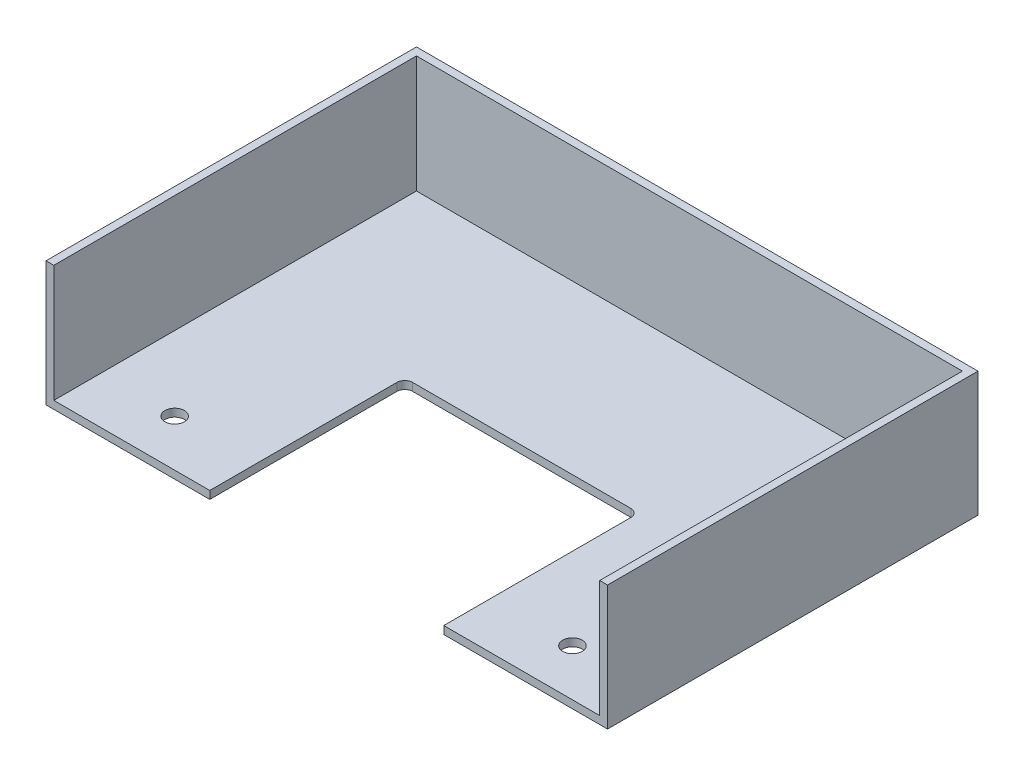
ISO-10303-21;
HEADER;
FILE_DESCRIPTION(('STEP AP214'),'2;1');
FILE_NAME('part.step','',(''),(''),'','','');
FILE_SCHEMA(('AUTOMOTIVE_DESIGN { 1 0 10303 214 1 1 1 1 }'));
ENDSEC;
DATA;
#1=APPLICATION_CONTEXT('core data for automotive mechanical design processes');
#2=APPLICATION_PROTOCOL_DEFINITION('international standard','automotive_design',2000,#1);
#3=PRODUCT_CONTEXT('',#1,'mechanical');
#4=PRODUCT('Part','Part','',(#3));
#5=PRODUCT_RELATED_PRODUCT_CATEGORY('part','',(#4));
#6=PRODUCT_DEFINITION_FORMATION('','',#4);
#7=PRODUCT_DEFINITION_CONTEXT('part definition',#1,'design');
#8=PRODUCT_DEFINITION('design','',#6,#7);
#9=PRODUCT_DEFINITION_SHAPE('','',#8);
#10=(LENGTH_UNIT() NAMED_UNIT(*) SI_UNIT(.MILLI.,.METRE.));
#11=(NAMED_UNIT(*) PLANE_ANGLE_UNIT() SI_UNIT($,.RADIAN.));
#12=(NAMED_UNIT(*) SI_UNIT($,.STERADIAN.) SOLID_ANGLE_UNIT());
#13=UNCERTAINTY_MEASURE_WITH_UNIT(LENGTH_MEASURE(1.E-05),#10,'distance_accuracy_value','');
#14=(GEOMETRIC_REPRESENTATION_CONTEXT(3) GLOBAL_UNCERTAINTY_ASSIGNED_CONTEXT((#13)) GLOBAL_UNIT_ASSIGNED_CONTEXT((#10,
#11,#12)) REPRESENTATION_CONTEXT('',''));
#15=CARTESIAN_POINT('',(0.,0.,0.));
#16=DIRECTION('',(0.,0.,1.));
#17=DIRECTION('',(1.,0.,0.));
#18=AXIS2_PLACEMENT_3D('',#15,#16,#17);
#19=CARTESIAN_POINT('',(0.,0.,0.));
#20=DIRECTION('',(0.,-1.,0.));
#21=DIRECTION('',(0.,0.,-1.));
#22=AXIS2_PLACEMENT_3D('',#19,#20,#21);
#23=PLANE('',#22);
#24=DIRECTION('',(0.,0.,1.));
#25=VECTOR('',#24,1.);
#26=CARTESIAN_POINT('',(30.,0.,-0.5));
#27=LINE('',#26,#25);
#28=CARTESIAN_POINT('',(30.,0.,-0.5));
#29=VERTEX_POINT('',#28);
#30=CARTESIAN_POINT('',(30.,0.,47.5));
#31=VERTEX_POINT('',#30);
#32=EDGE_CURVE('E140',#29,#31,#27,.T.);
#33=ORIENTED_EDGE('',*,*,#32,.F.);
#34=CARTESIAN_POINT('',(28.,0.,-0.5));
#35=DIRECTION('',(0.,-1.,0.));
#36=DIRECTION('',(0.,0.,-1.));
#37=AXIS2_PLACEMENT_3D('',#34,#35,#36);
#38=CIRCLE('',#37,2.);
#39=CARTESIAN_POINT('',(28.,0.,-2.5));
#40=VERTEX_POINT('',#39);
#41=EDGE_CURVE('E162',#40,#29,#38,.T.);
#42=ORIENTED_EDGE('',*,*,#41,.F.);
#43=DIRECTION('',(1.,0.,0.));
#44=VECTOR('',#43,1.);
#45=CARTESIAN_POINT('',(-28.,0.,-2.5));
#46=LINE('',#45,#44);
#47=CARTESIAN_POINT('',(-28.,0.,-2.5));
#48=VERTEX_POINT('',#47);
#49=EDGE_CURVE('E206',#48,#40,#46,.T.);
#50=ORIENTED_EDGE('',*,*,#49,.F.);
#51=CARTESIAN_POINT('',(-28.,0.,-0.5));
#52=DIRECTION('',(0.,-1.,0.));
#53=DIRECTION('',(0.,0.,-1.));
#54=AXIS2_PLACEMENT_3D('',#51,#52,#53);
#55=CIRCLE('',#54,2.);
#56=CARTESIAN_POINT('',(-30.,0.,-0.5));
#57=VERTEX_POINT('',#56);
#58=EDGE_CURVE('E217',#57,#48,#55,.T.);
#59=ORIENTED_EDGE('',*,*,#58,.F.);
#60=DIRECTION('',(0.,0.,-1.));
#61=VECTOR('',#60,1.);
#62=CARTESIAN_POINT('',(-30.,0.,47.5));
#63=LINE('',#62,#61);
#64=CARTESIAN_POINT('',(-30.,0.,47.5));
#65=VERTEX_POINT('',#64);
#66=EDGE_CURVE('E151',#65,#57,#63,.T.);
#67=ORIENTED_EDGE('',*,*,#66,.F.);
#68=DIRECTION('',(-1.,0.,0.));
#69=VECTOR('',#68,1.);
#70=CARTESIAN_POINT('',(72.,0.,47.5));
#71=LINE('',#70,#69);
#72=CARTESIAN_POINT('',(-72.,0.,47.5));
#73=VERTEX_POINT('',#72);
#74=EDGE_CURVE('E169',#65,#73,#71,.T.);
#75=ORIENTED_EDGE('',*,*,#74,.T.);
#76=DIRECTION('',(0.,0.,-1.));
#77=VECTOR('',#76,1.);
#78=CARTESIAN_POINT('',(-72.,0.,47.5));
#79=LINE('',#78,#77);
#80=CARTESIAN_POINT('',(-72.,0.,-47.5));
#81=VERTEX_POINT('',#80);
#82=EDGE_CURVE('E168',#73,#81,#79,.T.);
#83=ORIENTED_EDGE('',*,*,#82,.T.);
#84=DIRECTION('',(1.,0.,0.));
#85=VECTOR('',#84,1.);
#86=CARTESIAN_POINT('',(-72.,0.,-47.5));
#87=LINE('',#86,#85);
#88=CARTESIAN_POINT('',(72.,0.,-47.5));
#89=VERTEX_POINT('',#88);
#90=EDGE_CURVE('E172',#81,#89,#87,.T.);
#91=ORIENTED_EDGE('',*,*,#90,.T.);
#92=DIRECTION('',(0.,0.,1.));
#93=VECTOR('',#92,1.);
#94=CARTESIAN_POINT('',(72.,0.,-47.5));
#95=LINE('',#94,#93);
#96=CARTESIAN_POINT('',(72.,0.,47.5));
#97=VERTEX_POINT('',#96);
#98=EDGE_CURVE('E167',#89,#97,#95,.T.);
#99=ORIENTED_EDGE('',*,*,#98,.T.);
#100=EDGE_CURVE('E158',#97,#31,#71,.T.);
#101=ORIENTED_EDGE('',*,*,#100,.T.);
#102=EDGE_LOOP('',(#33,#42,#50,#59,#67,#75,#83,#91,#99,#101));
#103=FACE_BOUND('',#102,.T.);
#104=CARTESIAN_POINT('',(-51.,0.,35.5));
#105=DIRECTION('',(0.,1.,0.));
#106=DIRECTION('',(0.,0.,1.));
#107=AXIS2_PLACEMENT_3D('',#104,#105,#106);
#108=CIRCLE('',#107,2.49999999999999);
#109=CARTESIAN_POINT('',(-51.,0.,38.));
#110=VERTEX_POINT('',#109);
#111=EDGE_CURVE('E152',#110,#110,#108,.T.);
#112=ORIENTED_EDGE('',*,*,#111,.T.);
#113=EDGE_LOOP('',(#112));
#114=FACE_BOUND('',#113,.T.);
#115=CARTESIAN_POINT('',(51.,0.,35.5));
#116=DIRECTION('',(0.,1.,0.));
#117=DIRECTION('',(0.,0.,1.));
#118=AXIS2_PLACEMENT_3D('',#115,#116,#117);
#119=CIRCLE('',#118,2.49999999999999);
#120=CARTESIAN_POINT('',(51.,0.,38.));
#121=VERTEX_POINT('',#120);
#122=EDGE_CURVE('E341',#121,#121,#119,.T.);
#123=ORIENTED_EDGE('',*,*,#122,.T.);
#124=EDGE_LOOP('',(#123));
#125=FACE_BOUND('',#124,.T.);
#126=ADVANCED_FACE('F39',(#103,#114,#125),#23,.T.);
#127=CARTESIAN_POINT('',(72.,32.,47.5));
#128=DIRECTION('',(0.,0.,1.));
#129=DIRECTION('',(1.,0.,0.));
#130=AXIS2_PLACEMENT_3D('',#127,#128,#129);
#131=PLANE('',#130);
#132=DIRECTION('',(0.,-1.,0.));
#133=VECTOR('',#132,1.);
#134=CARTESIAN_POINT('',(30.,32.,47.5));
#135=LINE('',#134,#133);
#136=CARTESIAN_POINT('',(30.,1.99999999999999,47.5));
#137=VERTEX_POINT('',#136);
#138=EDGE_CURVE('E143',#137,#31,#135,.T.);
#139=ORIENTED_EDGE('',*,*,#138,.T.);
#140=ORIENTED_EDGE('',*,*,#100,.F.);
#141=DIRECTION('',(0.,-1.,0.));
#142=VECTOR('',#141,1.);
#143=CARTESIAN_POINT('',(72.,32.,47.5));
#144=LINE('',#143,#142);
#145=CARTESIAN_POINT('',(72.,32.,47.5));
#146=VERTEX_POINT('',#145);
#147=EDGE_CURVE('E187',#146,#97,#144,.T.);
#148=ORIENTED_EDGE('',*,*,#147,.F.);
#149=DIRECTION('',(-1.,0.,0.));
#150=VECTOR('',#149,1.);
#151=CARTESIAN_POINT('',(72.,32.,47.5));
#152=LINE('',#151,#150);
#153=CARTESIAN_POINT('',(70.,32.,47.5));
#154=VERTEX_POINT('',#153);
#155=EDGE_CURVE('E252',#146,#154,#152,.T.);
#156=ORIENTED_EDGE('',*,*,#155,.T.);
#157=DIRECTION('',(0.,1.,0.));
#158=VECTOR('',#157,1.);
#159=CARTESIAN_POINT('',(70.,1.99999999999999,47.5));
#160=LINE('',#159,#158);
#161=CARTESIAN_POINT('',(70.,1.99999999999999,47.5));
#162=VERTEX_POINT('',#161);
#163=EDGE_CURVE('E62',#162,#154,#160,.T.);
#164=ORIENTED_EDGE('',*,*,#163,.F.);
#165=DIRECTION('',(1.,0.,0.));
#166=VECTOR('',#165,1.);
#167=CARTESIAN_POINT('',(-70.,1.99999999999999,47.5));
#168=LINE('',#167,#166);
#169=EDGE_CURVE('E160',#137,#162,#168,.T.);
#170=ORIENTED_EDGE('',*,*,#169,.F.);
#171=EDGE_LOOP('',(#139,#140,#148,#156,#164,#170));
#172=FACE_BOUND('',#171,.T.);
#173=ADVANCED_FACE('F157',(#172),#131,.T.);
#174=CARTESIAN_POINT('',(72.,32.,-47.5));
#175=DIRECTION('',(1.,0.,0.));
#176=DIRECTION('',(0.,0.,-1.));
#177=AXIS2_PLACEMENT_3D('',#174,#175,#176);
#178=PLANE('',#177);
#179=ORIENTED_EDGE('',*,*,#98,.F.);
#180=DIRECTION('',(0.,-1.,0.));
#181=VECTOR('',#180,1.);
#182=CARTESIAN_POINT('',(72.,32.,-47.5));
#183=LINE('',#182,#181);
#184=CARTESIAN_POINT('',(72.,32.,-47.5));
#185=VERTEX_POINT('',#184);
#186=EDGE_CURVE('E179',#185,#89,#183,.T.);
#187=ORIENTED_EDGE('',*,*,#186,.F.);
#188=DIRECTION('',(0.,0.,1.));
#189=VECTOR('',#188,1.);
#190=CARTESIAN_POINT('',(72.,32.,-47.5));
#191=LINE('',#190,#189);
#192=EDGE_CURVE('E178',#185,#146,#191,.T.);
#193=ORIENTED_EDGE('',*,*,#192,.T.);
#194=ORIENTED_EDGE('',*,*,#147,.T.);
#195=EDGE_LOOP('',(#179,#187,#193,#194));
#196=FACE_BOUND('',#195,.T.);
#197=ADVANCED_FACE('F41',(#196),#178,.T.);
#198=CARTESIAN_POINT('',(-72.,32.,-47.5));
#199=DIRECTION('',(0.,0.,-1.));
#200=DIRECTION('',(-1.,0.,0.));
#201=AXIS2_PLACEMENT_3D('',#198,#199,#200);
#202=PLANE('',#201);
#203=ORIENTED_EDGE('',*,*,#90,.F.);
#204=DIRECTION('',(0.,-1.,0.));
#205=VECTOR('',#204,1.);
#206=CARTESIAN_POINT('',(-72.,32.,-47.5));
#207=LINE('',#206,#205);
#208=CARTESIAN_POINT('',(-72.,32.,-47.5));
#209=VERTEX_POINT('',#208);
#210=EDGE_CURVE('E182',#209,#81,#207,.T.);
#211=ORIENTED_EDGE('',*,*,#210,.F.);
#212=DIRECTION('',(1.,0.,0.));
#213=VECTOR('',#212,1.);
#214=CARTESIAN_POINT('',(-72.,32.,-47.5));
#215=LINE('',#214,#213);
#216=EDGE_CURVE('E189',#209,#185,#215,.T.);
#217=ORIENTED_EDGE('',*,*,#216,.T.);
#218=ORIENTED_EDGE('',*,*,#186,.T.);
#219=EDGE_LOOP('',(#203,#211,#217,#218));
#220=FACE_BOUND('',#219,.T.);
#221=ADVANCED_FACE('F261',(#220),#202,.T.);
#222=CARTESIAN_POINT('',(-72.,32.,47.5));
#223=DIRECTION('',(-1.,0.,0.));
#224=DIRECTION('',(0.,0.,1.));
#225=AXIS2_PLACEMENT_3D('',#222,#223,#224);
#226=PLANE('',#225);
#227=ORIENTED_EDGE('',*,*,#82,.F.);
#228=DIRECTION('',(0.,-1.,0.));
#229=VECTOR('',#228,1.);
#230=CARTESIAN_POINT('',(-72.,32.,47.5));
#231=LINE('',#230,#229);
#232=CARTESIAN_POINT('',(-72.,32.,47.5));
#233=VERTEX_POINT('',#232);
#234=EDGE_CURVE('E184',#233,#73,#231,.T.);
#235=ORIENTED_EDGE('',*,*,#234,.F.);
#236=DIRECTION('',(0.,0.,-1.));
#237=VECTOR('',#236,1.);
#238=CARTESIAN_POINT('',(-72.,32.,47.5));
#239=LINE('',#238,#237);
#240=EDGE_CURVE('E255',#233,#209,#239,.T.);
#241=ORIENTED_EDGE('',*,*,#240,.T.);
#242=ORIENTED_EDGE('',*,*,#210,.T.);
#243=EDGE_LOOP('',(#227,#235,#241,#242));
#244=FACE_BOUND('',#243,.T.);
#245=ADVANCED_FACE('F274',(#244),#226,.T.);
#246=DIRECTION('',(0.,-1.,0.));
#247=VECTOR('',#246,1.);
#248=CARTESIAN_POINT('',(-30.,32.,47.5));
#249=LINE('',#248,#247);
#250=CARTESIAN_POINT('',(-30.,1.99999999999999,47.5));
#251=VERTEX_POINT('',#250);
#252=EDGE_CURVE('E161',#251,#65,#249,.T.);
#253=ORIENTED_EDGE('',*,*,#252,.F.);
#254=CARTESIAN_POINT('',(-70.,1.99999999999999,47.5));
#255=VERTEX_POINT('',#254);
#256=EDGE_CURVE('E223',#255,#251,#168,.T.);
#257=ORIENTED_EDGE('',*,*,#256,.F.);
#258=DIRECTION('',(0.,1.,0.));
#259=VECTOR('',#258,1.);
#260=CARTESIAN_POINT('',(-70.,1.99999999999999,47.5));
#261=LINE('',#260,#259);
#262=CARTESIAN_POINT('',(-70.,32.,47.5));
#263=VERTEX_POINT('',#262);
#264=EDGE_CURVE('E241',#255,#263,#261,.T.);
#265=ORIENTED_EDGE('',*,*,#264,.T.);
#266=EDGE_CURVE('E251',#263,#233,#152,.T.);
#267=ORIENTED_EDGE('',*,*,#266,.T.);
#268=ORIENTED_EDGE('',*,*,#234,.T.);
#269=ORIENTED_EDGE('',*,*,#74,.F.);
#270=EDGE_LOOP('',(#253,#257,#265,#267,#268,#269));
#271=FACE_BOUND('',#270,.T.);
#272=ADVANCED_FACE('F277',(#271),#131,.T.);
#273=CARTESIAN_POINT('',(0.,32.,0.));
#274=DIRECTION('',(0.,-1.,0.));
#275=DIRECTION('',(0.,0.,-1.));
#276=AXIS2_PLACEMENT_3D('',#273,#274,#275);
#277=PLANE('',#276);
#278=ORIENTED_EDGE('',*,*,#266,.F.);
#279=DIRECTION('',(0.,0.,1.));
#280=VECTOR('',#279,1.);
#281=CARTESIAN_POINT('',(-70.,32.,-45.5));
#282=LINE('',#281,#280);
#283=CARTESIAN_POINT('',(-70.,32.,-45.5));
#284=VERTEX_POINT('',#283);
#285=EDGE_CURVE('E239',#284,#263,#282,.T.);
#286=ORIENTED_EDGE('',*,*,#285,.F.);
#287=DIRECTION('',(-1.,0.,0.));
#288=VECTOR('',#287,1.);
#289=CARTESIAN_POINT('',(70.,32.,-45.5));
#290=LINE('',#289,#288);
#291=CARTESIAN_POINT('',(70.,32.,-45.5));
#292=VERTEX_POINT('',#291);
#293=EDGE_CURVE('E236',#292,#284,#290,.T.);
#294=ORIENTED_EDGE('',*,*,#293,.F.);
#295=DIRECTION('',(0.,0.,-1.));
#296=VECTOR('',#295,1.);
#297=CARTESIAN_POINT('',(70.,32.,47.5));
#298=LINE('',#297,#296);
#299=EDGE_CURVE('E234',#154,#292,#298,.T.);
#300=ORIENTED_EDGE('',*,*,#299,.F.);
#301=ORIENTED_EDGE('',*,*,#155,.F.);
#302=ORIENTED_EDGE('',*,*,#192,.F.);
#303=ORIENTED_EDGE('',*,*,#216,.F.);
#304=ORIENTED_EDGE('',*,*,#240,.F.);
#305=EDGE_LOOP('',(#278,#286,#294,#300,#301,#302,#303,#304));
#306=FACE_BOUND('',#305,.T.);
#307=ADVANCED_FACE('F266',(#306),#277,.F.);
#308=CARTESIAN_POINT('',(-70.,1.99999999999999,-45.5));
#309=DIRECTION('',(-1.,0.,0.));
#310=DIRECTION('',(0.,0.,1.));
#311=AXIS2_PLACEMENT_3D('',#308,#309,#310);
#312=PLANE('',#311);
#313=ORIENTED_EDGE('',*,*,#285,.T.);
#314=ORIENTED_EDGE('',*,*,#264,.F.);
#315=DIRECTION('',(0.,0.,1.));
#316=VECTOR('',#315,1.);
#317=CARTESIAN_POINT('',(-70.,1.99999999999999,-45.5));
#318=LINE('',#317,#316);
#319=CARTESIAN_POINT('',(-70.,1.99999999999999,-45.5));
#320=VERTEX_POINT('',#319);
#321=EDGE_CURVE('E231',#320,#255,#318,.T.);
#322=ORIENTED_EDGE('',*,*,#321,.F.);
#323=DIRECTION('',(0.,1.,0.));
#324=VECTOR('',#323,1.);
#325=CARTESIAN_POINT('',(-70.,1.99999999999999,-45.5));
#326=LINE('',#325,#324);
#327=EDGE_CURVE('E244',#320,#284,#326,.T.);
#328=ORIENTED_EDGE('',*,*,#327,.T.);
#329=EDGE_LOOP('',(#313,#314,#322,#328));
#330=FACE_BOUND('',#329,.T.);
#331=ADVANCED_FACE('F282',(#330),#312,.F.);
#332=CARTESIAN_POINT('',(70.,1.99999999999999,-45.5));
#333=DIRECTION('',(0.,0.,-1.));
#334=DIRECTION('',(-1.,0.,0.));
#335=AXIS2_PLACEMENT_3D('',#332,#333,#334);
#336=PLANE('',#335);
#337=ORIENTED_EDGE('',*,*,#293,.T.);
#338=ORIENTED_EDGE('',*,*,#327,.F.);
#339=DIRECTION('',(-1.,0.,0.));
#340=VECTOR('',#339,1.);
#341=CARTESIAN_POINT('',(70.,1.99999999999999,-45.5));
#342=LINE('',#341,#340);
#343=CARTESIAN_POINT('',(70.,1.99999999999999,-45.5));
#344=VERTEX_POINT('',#343);
#345=EDGE_CURVE('E228',#344,#320,#342,.T.);
#346=ORIENTED_EDGE('',*,*,#345,.F.);
#347=DIRECTION('',(0.,1.,0.));
#348=VECTOR('',#347,1.);
#349=CARTESIAN_POINT('',(70.,1.99999999999999,-45.5));
#350=LINE('',#349,#348);
#351=EDGE_CURVE('E246',#344,#292,#350,.T.);
#352=ORIENTED_EDGE('',*,*,#351,.T.);
#353=EDGE_LOOP('',(#337,#338,#346,#352));
#354=FACE_BOUND('',#353,.T.);
#355=ADVANCED_FACE('F286',(#354),#336,.F.);
#356=CARTESIAN_POINT('',(70.,1.99999999999999,47.5));
#357=DIRECTION('',(1.,0.,0.));
#358=DIRECTION('',(0.,0.,-1.));
#359=AXIS2_PLACEMENT_3D('',#356,#357,#358);
#360=PLANE('',#359);
#361=ORIENTED_EDGE('',*,*,#299,.T.);
#362=ORIENTED_EDGE('',*,*,#351,.F.);
#363=DIRECTION('',(0.,0.,-1.));
#364=VECTOR('',#363,1.);
#365=CARTESIAN_POINT('',(70.,1.99999999999999,47.5));
#366=LINE('',#365,#364);
#367=EDGE_CURVE('E225',#162,#344,#366,.T.);
#368=ORIENTED_EDGE('',*,*,#367,.F.);
#369=ORIENTED_EDGE('',*,*,#163,.T.);
#370=EDGE_LOOP('',(#361,#362,#368,#369));
#371=FACE_BOUND('',#370,.T.);
#372=ADVANCED_FACE('F287',(#371),#360,.F.);
#373=CARTESIAN_POINT('',(0.,1.99999999999999,0.));
#374=DIRECTION('',(0.,1.,0.));
#375=DIRECTION('',(0.,0.,1.));
#376=AXIS2_PLACEMENT_3D('',#373,#374,#375);
#377=PLANE('',#376);
#378=CARTESIAN_POINT('',(51.,2.,35.5));
#379=DIRECTION('',(0.,1.,0.));
#380=DIRECTION('',(0.,0.,1.));
#381=AXIS2_PLACEMENT_3D('',#378,#379,#380);
#382=CIRCLE('',#381,2.49999999999999);
#383=CARTESIAN_POINT('',(51.,2.,38.));
#384=VERTEX_POINT('',#383);
#385=EDGE_CURVE('E344',#384,#384,#382,.T.);
#386=ORIENTED_EDGE('',*,*,#385,.F.);
#387=EDGE_LOOP('',(#386));
#388=FACE_BOUND('',#387,.T.);
#389=CARTESIAN_POINT('',(-51.,2.,35.5));
#390=DIRECTION('',(0.,1.,0.));
#391=DIRECTION('',(0.,0.,1.));
#392=AXIS2_PLACEMENT_3D('',#389,#390,#391);
#393=CIRCLE('',#392,2.49999999999999);
#394=CARTESIAN_POINT('',(-51.,2.,38.));
#395=VERTEX_POINT('',#394);
#396=EDGE_CURVE('E346',#395,#395,#393,.T.);
#397=ORIENTED_EDGE('',*,*,#396,.F.);
#398=EDGE_LOOP('',(#397));
#399=FACE_BOUND('',#398,.T.);
#400=DIRECTION('',(0.,0.,-1.));
#401=VECTOR('',#400,1.);
#402=CARTESIAN_POINT('',(30.,1.99999999999999,0.));
#403=LINE('',#402,#401);
#404=CARTESIAN_POINT('',(30.,1.99999999999999,-0.5));
#405=VERTEX_POINT('',#404);
#406=EDGE_CURVE('E11',#137,#405,#403,.T.);
#407=ORIENTED_EDGE('',*,*,#406,.F.);
#408=ORIENTED_EDGE('',*,*,#169,.T.);
#409=ORIENTED_EDGE('',*,*,#367,.T.);
#410=ORIENTED_EDGE('',*,*,#345,.T.);
#411=ORIENTED_EDGE('',*,*,#321,.T.);
#412=ORIENTED_EDGE('',*,*,#256,.T.);
#413=DIRECTION('',(0.,0.,1.));
#414=VECTOR('',#413,1.);
#415=CARTESIAN_POINT('',(-30.,1.99999999999999,0.));
#416=LINE('',#415,#414);
#417=CARTESIAN_POINT('',(-30.,1.99999999999999,-0.5));
#418=VERTEX_POINT('',#417);
#419=EDGE_CURVE('E181',#418,#251,#416,.T.);
#420=ORIENTED_EDGE('',*,*,#419,.F.);
#421=CARTESIAN_POINT('',(-28.,1.99999999999999,-0.5));
#422=DIRECTION('',(0.,1.,0.));
#423=DIRECTION('',(0.,0.,1.));
#424=AXIS2_PLACEMENT_3D('',#421,#422,#423);
#425=CIRCLE('',#424,2.);
#426=CARTESIAN_POINT('',(-28.,1.99999999999999,-2.5));
#427=VERTEX_POINT('',#426);
#428=EDGE_CURVE('E191',#427,#418,#425,.T.);
#429=ORIENTED_EDGE('',*,*,#428,.F.);
#430=DIRECTION('',(-1.,0.,0.));
#431=VECTOR('',#430,1.);
#432=CARTESIAN_POINT('',(0.,1.99999999999999,-2.5));
#433=LINE('',#432,#431);
#434=CARTESIAN_POINT('',(28.,1.99999999999999,-2.5));
#435=VERTEX_POINT('',#434);
#436=EDGE_CURVE('E193',#435,#427,#433,.T.);
#437=ORIENTED_EDGE('',*,*,#436,.F.);
#438=CARTESIAN_POINT('',(28.,1.99999999999999,-0.5));
#439=DIRECTION('',(0.,1.,0.));
#440=DIRECTION('',(0.,0.,1.));
#441=AXIS2_PLACEMENT_3D('',#438,#439,#440);
#442=CIRCLE('',#441,2.);
#443=EDGE_CURVE('E47',#405,#435,#442,.T.);
#444=ORIENTED_EDGE('',*,*,#443,.F.);
#445=EDGE_LOOP('',(#407,#408,#409,#410,#411,#412,#420,#429,#437,#444));
#446=FACE_BOUND('',#445,.T.);
#447=ADVANCED_FACE('F210',(#388,#399,#446),#377,.T.);
#448=CARTESIAN_POINT('',(30.,32.,-0.5));
#449=DIRECTION('',(1.,0.,0.));
#450=DIRECTION('',(0.,0.,-1.));
#451=AXIS2_PLACEMENT_3D('',#448,#449,#450);
#452=PLANE('',#451);
#453=ORIENTED_EDGE('',*,*,#406,.T.);
#454=DIRECTION('',(0.,-1.,0.));
#455=VECTOR('',#454,1.);
#456=CARTESIAN_POINT('',(30.,32.,-0.5));
#457=LINE('',#456,#455);
#458=EDGE_CURVE('E146',#405,#29,#457,.T.);
#459=ORIENTED_EDGE('',*,*,#458,.T.);
#460=ORIENTED_EDGE('',*,*,#32,.T.);
#461=ORIENTED_EDGE('',*,*,#138,.F.);
#462=EDGE_LOOP('',(#453,#459,#460,#461));
#463=FACE_BOUND('',#462,.T.);
#464=ADVANCED_FACE('F142',(#463),#452,.F.);
#465=CARTESIAN_POINT('',(28.,32.,-0.5));
#466=DIRECTION('',(0.,-1.,0.));
#467=DIRECTION('',(0.,0.,-1.));
#468=AXIS2_PLACEMENT_3D('',#465,#466,#467);
#469=CYLINDRICAL_SURFACE('',#468,2.);
#470=ORIENTED_EDGE('',*,*,#443,.T.);
#471=DIRECTION('',(0.,-1.,0.));
#472=VECTOR('',#471,1.);
#473=CARTESIAN_POINT('',(28.,32.,-2.5));
#474=LINE('',#473,#472);
#475=EDGE_CURVE('E198',#435,#40,#474,.T.);
#476=ORIENTED_EDGE('',*,*,#475,.T.);
#477=ORIENTED_EDGE('',*,*,#41,.T.);
#478=ORIENTED_EDGE('',*,*,#458,.F.);
#479=EDGE_LOOP('',(#470,#476,#477,#478));
#480=FACE_BOUND('',#479,.T.);
#481=ADVANCED_FACE('F197',(#480),#469,.F.);
#482=CARTESIAN_POINT('',(-28.,32.,-2.5));
#483=DIRECTION('',(0.,0.,-1.));
#484=DIRECTION('',(-1.,0.,0.));
#485=AXIS2_PLACEMENT_3D('',#482,#483,#484);
#486=PLANE('',#485);
#487=ORIENTED_EDGE('',*,*,#436,.T.);
#488=DIRECTION('',(0.,-1.,0.));
#489=VECTOR('',#488,1.);
#490=CARTESIAN_POINT('',(-28.,32.,-2.5));
#491=LINE('',#490,#489);
#492=EDGE_CURVE('E207',#427,#48,#491,.T.);
#493=ORIENTED_EDGE('',*,*,#492,.T.);
#494=ORIENTED_EDGE('',*,*,#49,.T.);
#495=ORIENTED_EDGE('',*,*,#475,.F.);
#496=EDGE_LOOP('',(#487,#493,#494,#495));
#497=FACE_BOUND('',#496,.T.);
#498=ADVANCED_FACE('F203',(#497),#486,.F.);
#499=CARTESIAN_POINT('',(-28.,32.,-0.5));
#500=DIRECTION('',(0.,-1.,0.));
#501=DIRECTION('',(0.,0.,-1.));
#502=AXIS2_PLACEMENT_3D('',#499,#500,#501);
#503=CYLINDRICAL_SURFACE('',#502,2.);
#504=ORIENTED_EDGE('',*,*,#428,.T.);
#505=DIRECTION('',(0.,-1.,0.));
#506=VECTOR('',#505,1.);
#507=CARTESIAN_POINT('',(-30.,32.,-0.5));
#508=LINE('',#507,#506);
#509=EDGE_CURVE('E54',#418,#57,#508,.T.);
#510=ORIENTED_EDGE('',*,*,#509,.T.);
#511=ORIENTED_EDGE('',*,*,#58,.T.);
#512=ORIENTED_EDGE('',*,*,#492,.F.);
#513=EDGE_LOOP('',(#504,#510,#511,#512));
#514=FACE_BOUND('',#513,.T.);
#515=ADVANCED_FACE('F214',(#514),#503,.F.);
#516=CARTESIAN_POINT('',(-30.,32.,47.5));
#517=DIRECTION('',(-1.,0.,0.));
#518=DIRECTION('',(0.,0.,1.));
#519=AXIS2_PLACEMENT_3D('',#516,#517,#518);
#520=PLANE('',#519);
#521=ORIENTED_EDGE('',*,*,#419,.T.);
#522=ORIENTED_EDGE('',*,*,#252,.T.);
#523=ORIENTED_EDGE('',*,*,#66,.T.);
#524=ORIENTED_EDGE('',*,*,#509,.F.);
#525=EDGE_LOOP('',(#521,#522,#523,#524));
#526=FACE_BOUND('',#525,.T.);
#527=ADVANCED_FACE('F320',(#526),#520,.F.);
#528=CARTESIAN_POINT('',(-51.,1.99999999999999,35.5));
#529=DIRECTION('',(0.,1.,0.));
#530=DIRECTION('',(0.,0.,1.));
#531=AXIS2_PLACEMENT_3D('',#528,#529,#530);
#532=CYLINDRICAL_SURFACE('',#531,2.49999999999999);
#533=ORIENTED_EDGE('',*,*,#111,.F.);
#534=EDGE_LOOP('',(#533));
#535=FACE_BOUND('',#534,.T.);
#536=ORIENTED_EDGE('',*,*,#396,.T.);
#537=EDGE_LOOP('',(#536));
#538=FACE_BOUND('',#537,.T.);
#539=ADVANCED_FACE('F323',(#535,#538),#532,.F.);
#540=CARTESIAN_POINT('',(51.,1.99999999999999,35.5));
#541=DIRECTION('',(0.,1.,0.));
#542=DIRECTION('',(0.,0.,1.));
#543=AXIS2_PLACEMENT_3D('',#540,#541,#542);
#544=CYLINDRICAL_SURFACE('',#543,2.49999999999999);
#545=ORIENTED_EDGE('',*,*,#122,.F.);
#546=EDGE_LOOP('',(#545));
#547=FACE_BOUND('',#546,.T.);
#548=ORIENTED_EDGE('',*,*,#385,.T.);
#549=EDGE_LOOP('',(#548));
#550=FACE_BOUND('',#549,.T.);
#551=ADVANCED_FACE('F332',(#547,#550),#544,.F.);
#552=CLOSED_SHELL('',(#126,#173,#197,#221,#245,#272,#307,#331,#355,#372,#447,#464,#481,#498,
#515,#527,#539,#551));
#553=MANIFOLD_SOLID_BREP('B2',#552);
#554=ADVANCED_BREP_SHAPE_REPRESENTATION('',(#18,#553),#14);
#555=SHAPE_DEFINITION_REPRESENTATION(#9,#554);
ENDSEC;
END-ISO-10303-21;
